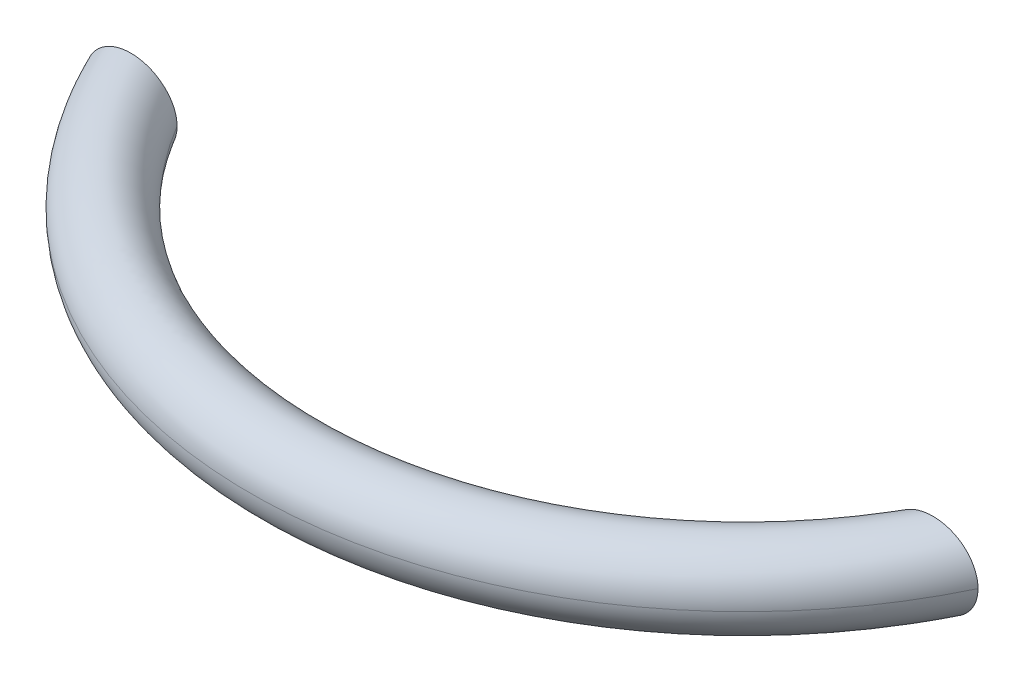
ISO-10303-21;
HEADER;
FILE_DESCRIPTION(('STEP AP214'),'2;1');
FILE_NAME('part.step','',(''),(''),'','','');
FILE_SCHEMA(('AUTOMOTIVE_DESIGN { 1 0 10303 214 1 1 1 1 }'));
ENDSEC;
DATA;
#1=APPLICATION_CONTEXT('core data for automotive mechanical design processes');
#2=APPLICATION_PROTOCOL_DEFINITION('international standard','automotive_design',2000,#1);
#3=PRODUCT_CONTEXT('',#1,'mechanical');
#4=PRODUCT('Part','Part','',(#3));
#5=PRODUCT_RELATED_PRODUCT_CATEGORY('part','',(#4));
#6=PRODUCT_DEFINITION_FORMATION('','',#4);
#7=PRODUCT_DEFINITION_CONTEXT('part definition',#1,'design');
#8=PRODUCT_DEFINITION('design','',#6,#7);
#9=PRODUCT_DEFINITION_SHAPE('','',#8);
#10=(LENGTH_UNIT() NAMED_UNIT(*) SI_UNIT(.MILLI.,.METRE.));
#11=(NAMED_UNIT(*) PLANE_ANGLE_UNIT() SI_UNIT($,.RADIAN.));
#12=(NAMED_UNIT(*) SI_UNIT($,.STERADIAN.) SOLID_ANGLE_UNIT());
#13=UNCERTAINTY_MEASURE_WITH_UNIT(LENGTH_MEASURE(1.E-05),#10,'distance_accuracy_value','');
#14=(GEOMETRIC_REPRESENTATION_CONTEXT(3) GLOBAL_UNCERTAINTY_ASSIGNED_CONTEXT((#13)) GLOBAL_UNIT_ASSIGNED_CONTEXT((#10,
#11,#12)) REPRESENTATION_CONTEXT('',''));
#15=CARTESIAN_POINT('',(0.,0.,0.));
#16=DIRECTION('',(0.,0.,1.));
#17=DIRECTION('',(1.,0.,0.));
#18=AXIS2_PLACEMENT_3D('',#15,#16,#17);
#19=CARTESIAN_POINT('',(48.,0.,5.));
#20=DIRECTION('',(0.,0.,1.));
#21=DIRECTION('',(1.,0.,0.));
#22=AXIS2_PLACEMENT_3D('',#19,#20,#21);
#23=PLANE('',#22);
#24=CARTESIAN_POINT('',(48.,0.,5.));
#25=DIRECTION('',(0.,0.,-1.));
#26=DIRECTION('',(0.,1.,0.));
#27=AXIS2_PLACEMENT_3D('',#24,#25,#26);
#28=CIRCLE('',#27,2.);
#29=CARTESIAN_POINT('',(48.,2.,5.));
#30=VERTEX_POINT('',#29);
#31=EDGE_CURVE('E18',#30,#30,#28,.F.);
#32=ORIENTED_EDGE('',*,*,#31,.F.);
#33=EDGE_LOOP('',(#32));
#34=FACE_BOUND('',#33,.T.);
#35=ADVANCED_FACE('F15',(#34),#23,.F.);
#36=CARTESIAN_POINT('',(-48.,0.,5.));
#37=DIRECTION('',(0.,0.,1.));
#38=DIRECTION('',(1.,0.,0.));
#39=AXIS2_PLACEMENT_3D('',#36,#37,#38);
#40=PLANE('',#39);
#41=CARTESIAN_POINT('',(-48.,0.,5.));
#42=DIRECTION('',(0.,0.,-1.));
#43=DIRECTION('',(0.,1.,0.));
#44=AXIS2_PLACEMENT_3D('',#41,#42,#43);
#45=CIRCLE('',#44,2.);
#46=CARTESIAN_POINT('',(-48.,2.,5.));
#47=VERTEX_POINT('',#46);
#48=EDGE_CURVE('E117',#47,#47,#45,.F.);
#49=ORIENTED_EDGE('',*,*,#48,.F.);
#50=EDGE_LOOP('',(#49));
#51=FACE_BOUND('',#50,.T.);
#52=ADVANCED_FACE('F106',(#51),#40,.F.);
#53=CARTESIAN_POINT('',(48.,0.,5.));
#54=DIRECTION('',(0.,0.,-1.));
#55=DIRECTION('',(0.,1.,0.));
#56=AXIS2_PLACEMENT_3D('',#53,#54,#55);
#57=CYLINDRICAL_SURFACE('',#56,2.);
#58=ORIENTED_EDGE('',*,*,#31,.T.);
#59=EDGE_LOOP('',(#58));
#60=FACE_BOUND('',#59,.T.);
#61=CARTESIAN_POINT('',(48.,0.,0.));
#62=DIRECTION('',(0.,0.,-1.));
#63=DIRECTION('',(0.,1.,0.));
#64=AXIS2_PLACEMENT_3D('',#61,#62,#63);
#65=CIRCLE('',#64,2.);
#66=CARTESIAN_POINT('',(48.,2.,0.));
#67=VERTEX_POINT('',#66);
#68=EDGE_CURVE('E118',#67,#67,#65,.F.);
#69=ORIENTED_EDGE('',*,*,#68,.F.);
#70=EDGE_LOOP('',(#69));
#71=FACE_BOUND('',#70,.T.);
#72=ADVANCED_FACE('F103',(#60,#71),#57,.F.);
#73=CARTESIAN_POINT('',(-48.,0.,5.));
#74=DIRECTION('',(0.,0.,-1.));
#75=DIRECTION('',(0.,1.,0.));
#76=AXIS2_PLACEMENT_3D('',#73,#74,#75);
#77=CYLINDRICAL_SURFACE('',#76,2.);
#78=ORIENTED_EDGE('',*,*,#48,.T.);
#79=EDGE_LOOP('',(#78));
#80=FACE_BOUND('',#79,.T.);
#81=CARTESIAN_POINT('',(-48.,0.,0.));
#82=DIRECTION('',(0.,0.,-1.));
#83=DIRECTION('',(0.,1.,0.));
#84=AXIS2_PLACEMENT_3D('',#81,#82,#83);
#85=CIRCLE('',#84,2.);
#86=CARTESIAN_POINT('',(-48.,2.,0.));
#87=VERTEX_POINT('',#86);
#88=EDGE_CURVE('E52',#87,#87,#85,.F.);
#89=ORIENTED_EDGE('',*,*,#88,.F.);
#90=EDGE_LOOP('',(#89));
#91=FACE_BOUND('',#90,.T.);
#92=ADVANCED_FACE('F98',(#80,#91),#77,.F.);
#93=CARTESIAN_POINT('',(-300.,-100.,0.));
#94=DIRECTION('',(0.,0.,1.));
#95=DIRECTION('',(1.,0.,0.));
#96=AXIS2_PLACEMENT_3D('',#93,#94,#95);
#97=PLANE('',#96);
#98=ORIENTED_EDGE('',*,*,#68,.T.);
#99=EDGE_LOOP('',(#98));
#100=FACE_BOUND('',#99,.T.);
#101=CARTESIAN_POINT('',(44.16082620787,0.,0.));
#102=CARTESIAN_POINT('',(44.1607976121978,-0.126758896457329,0.));
#103=CARTESIAN_POINT('',(44.1664467931148,-0.253507135557029,0.));
#104=CARTESIAN_POINT('',(44.1888878800013,-0.505966477043828,0.));
#105=CARTESIAN_POINT('',(44.2056755439542,-0.631677955828245,0.));
#106=CARTESIAN_POINT('',(44.2500779915023,-0.88056815615185,0.));
#107=CARTESIAN_POINT('',(44.2776422638022,-1.00375591221587,0.));
#108=CARTESIAN_POINT('',(44.3432128256796,-1.24731976918636,0.));
#109=CARTESIAN_POINT('',(44.3812196841951,-1.36769571651069,0.));
#110=CARTESIAN_POINT('',(44.4671304037343,-1.60467410485182,0.));
#111=CARTESIAN_POINT('',(44.515020558891,-1.72128151567552,0.));
#112=CARTESIAN_POINT('',(44.6201513745664,-1.95021941574082,0.));
#113=CARTESIAN_POINT('',(44.6773955790556,-2.06254826399504,0.));
#114=CARTESIAN_POINT('',(44.8622962912611,-2.39228101992836,0.));
#115=CARTESIAN_POINT('',(45.0031263752589,-2.60244600053541,0.));
#116=CARTESIAN_POINT('',(45.3233983352066,-3.01093822397029,0.));
#117=CARTESIAN_POINT('',(45.5046132868082,-3.20785989455715,0.));
#118=CARTESIAN_POINT('',(45.8939695752766,-3.57294610508179,0.));
#119=CARTESIAN_POINT('',(46.1021206484178,-3.74110019546751,0.));
#120=CARTESIAN_POINT('',(46.5693268064275,-4.0677162327602,0.));
#121=CARTESIAN_POINT('',(46.8314570148859,-4.22177090257292,0.));
#122=CARTESIAN_POINT('',(47.3758145396278,-4.48923793603577,0.));
#123=CARTESIAN_POINT('',(47.6580519661073,-4.60262967841921,0.));
#124=CARTESIAN_POINT('',(48.1087565258962,-4.74706979056194,0.));
#125=CARTESIAN_POINT('',(48.2727971004219,-4.79241667251744,0.));
#126=CARTESIAN_POINT('',(48.6039659467458,-4.86989103222702,0.));
#127=CARTESIAN_POINT('',(48.7710936073983,-4.90202109779854,0.));
#128=CARTESIAN_POINT('',(49.1073641094704,-4.95293796255453,0.));
#129=CARTESIAN_POINT('',(49.2765068769929,-4.97172524951722,0.));
#130=CARTESIAN_POINT('',(49.615899632548,-4.99587278804959,0.));
#131=CARTESIAN_POINT('',(49.7861506555518,-5.00121784697606,0.));
#132=CARTESIAN_POINT('',(50.3167513801996,-4.99670395586458,0.));
#133=CARTESIAN_POINT('',(50.6771910185005,-4.96321743424142,0.));
#134=CARTESIAN_POINT('',(51.3869167325174,-4.83456723029916,0.));
#135=CARTESIAN_POINT('',(51.736207335051,-4.73942892334753,0.));
#136=CARTESIAN_POINT('',(52.2384833402548,-4.55250119571357,0.));
#137=CARTESIAN_POINT('',(52.4003863665284,-4.48395235428304,0.));
#138=CARTESIAN_POINT('',(52.7172250557413,-4.33251226860007,0.));
#139=CARTESIAN_POINT('',(52.8721669256975,-4.24963413440816,0.));
#140=CARTESIAN_POINT('',(53.1736281886951,-4.06979284606716,0.));
#141=CARTESIAN_POINT('',(53.3201485090235,-3.97283124679449,0.));
#142=CARTESIAN_POINT('',(53.6032122460092,-3.76522947319249,0.));
#143=CARTESIAN_POINT('',(53.7397546839739,-3.65458795990985,0.));
#144=CARTESIAN_POINT('',(53.9889091157819,-3.43126761489818,0.));
#145=CARTESIAN_POINT('',(54.1025645300031,-3.31975192681105,0.));
#146=CARTESIAN_POINT('',(54.3190394126719,-3.08665899122357,0.));
#147=CARTESIAN_POINT('',(54.4218602394493,-2.96508300840017,0.));
#148=CARTESIAN_POINT('',(54.6154175331754,-2.71269875792599,0.));
#149=CARTESIAN_POINT('',(54.7061568936767,-2.58189271243093,0.));
#150=CARTESIAN_POINT('',(54.8743883049809,-2.31202604399339,0.));
#151=CARTESIAN_POINT('',(54.9518823104442,-2.17296664311337,0.));
#152=CARTESIAN_POINT('',(55.084693837362,-1.90369980004117,0.));
#153=CARTESIAN_POINT('',(55.1415207939843,-1.7742350104066,0.));
#154=CARTESIAN_POINT('',(55.2431975111577,-1.5106920169143,0.));
#155=CARTESIAN_POINT('',(55.2880489768931,-1.37661447293682,0.));
#156=CARTESIAN_POINT('',(55.3651488155189,-1.1051777473328,0.));
#157=CARTESIAN_POINT('',(55.3974223663554,-0.967825711768883,0.));
#158=CARTESIAN_POINT('',(55.4490669316481,-0.690781954694624,0.));
#159=CARTESIAN_POINT('',(55.4684462995686,-0.551091808183845,0.));
#160=CARTESIAN_POINT('',(55.4875076289764,-0.342504785007338,0.));
#161=CARTESIAN_POINT('',(55.4921943619742,-0.274032624666117,0.));
#162=CARTESIAN_POINT('',(55.498438453907,-0.137043581011102,0.));
#163=CARTESIAN_POINT('',(55.500000263258,-0.0685269005130842,0.));
#164=CARTESIAN_POINT('',(55.4999999993203,0.,0.));
#165=B_SPLINE_CURVE_WITH_KNOTS('',3,(#101,#102,#103,#104,#105,#106,#107,#108,#109,#110,#111,
#112,#113,#114,#115,#116,#117,#118,#119,#120,#121,#122,#123,#124,#125,#126,#127,#128,#129,#130,
#131,#132,#133,#134,#135,#136,#137,#138,#139,#140,#141,#142,#143,#144,#145,#146,#147,#148,#149,
#150,#151,#152,#153,#154,#155,#156,#157,#158,#159,#160,#161,#162,#163,#164),.UNSPECIFIED.,.F.,
.F.,(4,2,2,2,2,2,2,2,2,2,2,2,2,2,2,2,2,2,2,2,2,2,2,2,2,2,2,2,2,2,2,4),(0.,0.38013416915592,
0.760123649801504,1.13835302296334,1.51660300708787,1.8943319281141,2.27220429260185,
3.02790205403033,3.82767995687209,4.62774775749237,5.53632084965965,6.44535405430686,
6.95546660717311,7.46547923376564,7.97547321462785,8.48604334116439,9.56646357816603,
10.6464394052935,11.1732923039239,11.6996657041919,12.2259810346347,12.7523479202515,
13.2293746140697,13.7063414318252,14.1831938081122,14.6599757528552,15.0835787694388,
15.5071214371872,15.9298118658773,16.3522281882993,16.55806411932,16.7636066961601),.UNSPECIFIED.);
#166=CARTESIAN_POINT('',(44.16082620787,8.56729720200068E-11,0.));
#167=VERTEX_POINT('',#166);
#168=CARTESIAN_POINT('',(55.4999999993203,3.00001724467243E-10,0.));
#169=VERTEX_POINT('',#168);
#170=EDGE_CURVE('E43',#167,#169,#165,.T.);
#171=ORIENTED_EDGE('',*,*,#170,.F.);
#172=CARTESIAN_POINT('',(55.4999999993203,0.,0.));
#173=CARTESIAN_POINT('',(55.5000226893428,0.130519562455404,0.));
#174=CARTESIAN_POINT('',(55.4943375926483,0.261032362661259,0.));
#175=CARTESIAN_POINT('',(55.4717186280668,0.521049910770463,0.));
#176=CARTESIAN_POINT('',(55.4547873930845,0.650554887443749,0.));
#177=CARTESIAN_POINT('',(55.4099139265116,0.907217493159661,0.));
#178=CARTESIAN_POINT('',(55.382006709966,1.03438125367753,0.));
#179=CARTESIAN_POINT('',(55.3154918027981,1.28587837162248,0.));
#180=CARTESIAN_POINT('',(55.2768838603252,1.41021166235753,0.));
#181=CARTESIAN_POINT('',(55.1894036741985,1.65511662129208,0.));
#182=CARTESIAN_POINT('',(55.1405381770358,1.77569070238814,0.));
#183=CARTESIAN_POINT('',(55.0330044325842,2.01243377196767,0.));
#184=CARTESIAN_POINT('',(54.974332539828,2.12860110249083,0.));
#185=CARTESIAN_POINT('',(54.8477624148383,2.35579631678699,0.));
#186=CARTESIAN_POINT('',(54.7798638050831,2.46682399001571,0.));
#187=CARTESIAN_POINT('',(54.6354370678797,2.68316802762187,0.));
#188=CARTESIAN_POINT('',(54.5589056538459,2.78848219406565,0.));
#189=CARTESIAN_POINT('',(54.3949510194064,2.99655881952504,0.));
#190=CARTESIAN_POINT('',(54.3072328467341,3.09908906747247,0.));
#191=CARTESIAN_POINT('',(54.1239947181904,3.29694524501976,0.));
#192=CARTESIAN_POINT('',(54.0284719610492,3.39226856401869,0.));
#193=CARTESIAN_POINT('',(53.7313495568696,3.66677146196183,0.));
#194=CARTESIAN_POINT('',(53.519093464157,3.83461260686507,0.));
#195=CARTESIAN_POINT('',(53.0518300248272,4.15146540242182,0.));
#196=CARTESIAN_POINT('',(52.7946842875618,4.29729900698631,0.));
#197=CARTESIAN_POINT('',(52.261305276997,4.54839488048717,0.));
#198=CARTESIAN_POINT('',(51.9850648292411,4.65364180099749,0.));
#199=CARTESIAN_POINT('',(51.3909049627061,4.83177537724478,0.));
#200=CARTESIAN_POINT('',(51.0716367682829,4.90016503348468,0.));
#201=CARTESIAN_POINT('',(50.4263428372831,4.98688611627549,0.));
#202=CARTESIAN_POINT('',(50.1003140888399,5.00519472674161,0.));
#203=CARTESIAN_POINT('',(49.4223163346862,4.99174552735896,0.));
#204=CARTESIAN_POINT('',(49.0704296897963,4.95572615595388,0.));
#205=CARTESIAN_POINT('',(48.3769913906184,4.82644878340789,0.));
#206=CARTESIAN_POINT('',(48.0354433834846,4.7331708245265,0.));
#207=CARTESIAN_POINT('',(47.5351370433214,4.55006354265161,0.));
#208=CARTESIAN_POINT('',(47.3686032091545,4.48081617659275,0.));
#209=CARTESIAN_POINT('',(47.0423111513753,4.32791880380597,0.));
#210=CARTESIAN_POINT('',(46.882549891621,4.24427533779067,0.));
#211=CARTESIAN_POINT('',(46.5712109625042,4.06279318144531,0.));
#212=CARTESIAN_POINT('',(46.41963675473,3.96494855016139,0.));
#213=CARTESIAN_POINT('',(46.1264254070305,3.75548605170735,0.));
#214=CARTESIAN_POINT('',(45.9847823734137,3.64387646379353,0.));
#215=CARTESIAN_POINT('',(45.7225426821308,3.41556393932564,0.));
#216=CARTESIAN_POINT('',(45.6011673589879,3.29975583283478,0.));
#217=CARTESIAN_POINT('',(45.3699968548984,3.05720456687635,0.));
#218=CARTESIAN_POINT('',(45.2601948516754,2.93046793061828,0.));
#219=CARTESIAN_POINT('',(45.0536800701365,2.66677981475632,0.));
#220=CARTESIAN_POINT('',(44.9569635329763,2.52983128616112,0.));
#221=CARTESIAN_POINT('',(44.778178784938,2.24669135696689,0.));
#222=CARTESIAN_POINT('',(44.6961068894157,2.10050229389075,0.));
#223=CARTESIAN_POINT('',(44.5586244262845,1.82147653857728,0.));
#224=CARTESIAN_POINT('',(44.501083418492,1.68968679610439,0.));
#225=CARTESIAN_POINT('',(44.3987820483504,1.4212462082359,0.));
#226=CARTESIAN_POINT('',(44.3540189679259,1.28459640362088,0.));
#227=CARTESIAN_POINT('',(44.2781106807407,1.00795693146104,0.));
#228=CARTESIAN_POINT('',(44.2469296349847,0.867977094219688,0.));
#229=CARTESIAN_POINT('',(44.1985835907358,0.585692790362598,0.));
#230=CARTESIAN_POINT('',(44.1814072305328,0.443390303867156,1.23770393106307E-13));
#231=CARTESIAN_POINT('',(44.1678597990366,0.250588805341285,0.));
#232=CARTESIAN_POINT('',(44.1652212366122,0.200474728652236,0.));
#233=CARTESIAN_POINT('',(44.1617056981853,0.100242966690741,0.));
#234=CARTESIAN_POINT('',(44.1608266844643,0.0501253528895574,0.));
#235=CARTESIAN_POINT('',(44.16082620787,0.,0.));
#236=B_SPLINE_CURVE_WITH_KNOTS('',3,(#172,#173,#174,#175,#176,#177,#178,#179,#180,#181,#182,
#183,#184,#185,#186,#187,#188,#189,#190,#191,#192,#193,#194,#195,#196,#197,#198,#199,#200,#201,
#202,#203,#204,#205,#206,#207,#208,#209,#210,#211,#212,#213,#214,#215,#216,#217,#218,#219,#220,
#221,#222,#223,#224,#225,#226,#227,#228,#229,#230,#231,#232,#233,#234,#235),.UNSPECIFIED.,.F.,
.F.,(4,2,2,2,2,2,2,2,2,2,2,2,2,2,2,2,2,2,2,2,2,2,2,2,2,2,2,2,2,2,2,4),(0.,0.391424526781845,
0.782757446973487,1.17285195205057,1.56295563910936,1.95280355069989,2.34279670951008,
2.73280583014326,3.12296393507201,3.52731584629899,3.93181353301827,4.74032117920115,
5.62361946326044,6.50725145220503,7.48267007972721,8.45853301766729,9.51502355571004,
10.5718825475843,11.1123756966022,11.6526239235259,12.193098814294,12.7332501947913,
13.2358154632633,13.738082801342,14.2402055537153,14.7422017915177,15.1729996523089,
15.6037058069051,16.0332684663781,16.4624822828667,16.6130096162902,16.763362524194),.UNSPECIFIED.);
#237=EDGE_CURVE('E40',#169,#167,#236,.T.);
#238=ORIENTED_EDGE('',*,*,#237,.F.);
#239=EDGE_LOOP('',(#171,#238));
#240=FACE_BOUND('',#239,.T.);
#241=ADVANCED_FACE('F44',(#100,#240),#97,.F.);
#242=CARTESIAN_POINT('',(-300.,-100.,0.));
#243=DIRECTION('',(0.,0.,1.));
#244=DIRECTION('',(1.,0.,0.));
#245=AXIS2_PLACEMENT_3D('',#242,#243,#244);
#246=PLANE('',#245);
#247=ORIENTED_EDGE('',*,*,#88,.T.);
#248=EDGE_LOOP('',(#247));
#249=FACE_BOUND('',#248,.T.);
#250=CARTESIAN_POINT('',(-44.16082620787,0.,0.));
#251=CARTESIAN_POINT('',(-44.1607976121978,0.126758896457261,0.));
#252=CARTESIAN_POINT('',(-44.1664467931148,0.253507135556961,0.));
#253=CARTESIAN_POINT('',(-44.1888878800013,0.505966477043759,0.));
#254=CARTESIAN_POINT('',(-44.2056755439542,0.631677955828175,0.));
#255=CARTESIAN_POINT('',(-44.2500779915022,0.88056815615178,0.));
#256=CARTESIAN_POINT('',(-44.2776422638022,1.0037559122158,0.));
#257=CARTESIAN_POINT('',(-44.3432128256796,1.2473197691863,0.));
#258=CARTESIAN_POINT('',(-44.3812196841951,1.36769571651062,0.));
#259=CARTESIAN_POINT('',(-44.4671304037343,1.60467410485177,0.));
#260=CARTESIAN_POINT('',(-44.5150205588909,1.72128151567547,0.));
#261=CARTESIAN_POINT('',(-44.6201513745664,1.95021941574078,0.));
#262=CARTESIAN_POINT('',(-44.6773955790556,2.06254826399499,0.));
#263=CARTESIAN_POINT('',(-44.862296291261,2.3922810199283,0.));
#264=CARTESIAN_POINT('',(-45.0031263752588,2.60244600053536,0.));
#265=CARTESIAN_POINT('',(-45.3233983352065,3.01093822397024,0.));
#266=CARTESIAN_POINT('',(-45.5046132868082,3.20785989455708,0.));
#267=CARTESIAN_POINT('',(-45.8939695752765,3.57294610508172,0.));
#268=CARTESIAN_POINT('',(-46.1021206484177,3.74110019546746,0.));
#269=CARTESIAN_POINT('',(-46.5693268064274,4.06771623276016,0.));
#270=CARTESIAN_POINT('',(-46.8314570148858,4.22177090257289,0.));
#271=CARTESIAN_POINT('',(-47.3758145396277,4.48923793603574,0.));
#272=CARTESIAN_POINT('',(-47.6580519661072,4.6026296784192,0.));
#273=CARTESIAN_POINT('',(-48.108756525896,4.74706979056193,0.));
#274=CARTESIAN_POINT('',(-48.2727971004218,4.79241667251743,0.));
#275=CARTESIAN_POINT('',(-48.6039659467457,4.86989103222701,0.));
#276=CARTESIAN_POINT('',(-48.7710936073982,4.90202109779853,0.));
#277=CARTESIAN_POINT('',(-49.1073641094702,4.95293796255453,0.));
#278=CARTESIAN_POINT('',(-49.2765068769928,4.97172524951722,0.));
#279=CARTESIAN_POINT('',(-49.6158996325479,4.9958727880496,0.));
#280=CARTESIAN_POINT('',(-49.7861506555516,5.00121784697607,0.));
#281=CARTESIAN_POINT('',(-50.3167513801995,4.9967039558646,0.));
#282=CARTESIAN_POINT('',(-50.6771910185004,4.96321743424144,0.));
#283=CARTESIAN_POINT('',(-51.3869167325174,4.83456723029919,0.));
#284=CARTESIAN_POINT('',(-51.7362073350509,4.73942892334758,0.));
#285=CARTESIAN_POINT('',(-52.2384833402548,4.55250119571363,0.));
#286=CARTESIAN_POINT('',(-52.4003863665283,4.48395235428308,0.));
#287=CARTESIAN_POINT('',(-52.7172250557412,4.33251226860011,0.));
#288=CARTESIAN_POINT('',(-52.8721669256974,4.2496341344082,0.));
#289=CARTESIAN_POINT('',(-53.1736281886951,4.0697928460672,0.));
#290=CARTESIAN_POINT('',(-53.3201485090235,3.97283124679453,0.));
#291=CARTESIAN_POINT('',(-53.6032122460092,3.76522947319253,0.));
#292=CARTESIAN_POINT('',(-53.7397546839739,3.65458795990988,0.));
#293=CARTESIAN_POINT('',(-53.9889091157818,3.43126761489821,0.));
#294=CARTESIAN_POINT('',(-54.1025645300031,3.31975192681109,0.));
#295=CARTESIAN_POINT('',(-54.3190394126719,3.08665899122361,0.));
#296=CARTESIAN_POINT('',(-54.4218602394493,2.96508300840022,0.));
#297=CARTESIAN_POINT('',(-54.6154175331754,2.71269875792605,0.));
#298=CARTESIAN_POINT('',(-54.7061568936767,2.58189271243099,0.));
#299=CARTESIAN_POINT('',(-54.8743883049809,2.31202604399347,0.));
#300=CARTESIAN_POINT('',(-54.9518823104442,2.17296664311345,0.));
#301=CARTESIAN_POINT('',(-55.084693837362,1.90369980004125,0.));
#302=CARTESIAN_POINT('',(-55.1415207939843,1.77423501040668,0.));
#303=CARTESIAN_POINT('',(-55.2431975111576,1.51069201691438,0.));
#304=CARTESIAN_POINT('',(-55.2880489768931,1.3766144729369,0.));
#305=CARTESIAN_POINT('',(-55.3651488155188,1.1051777473329,0.));
#306=CARTESIAN_POINT('',(-55.3974223663554,0.967825711768986,0.));
#307=CARTESIAN_POINT('',(-55.4490669316481,0.690781954694731,0.));
#308=CARTESIAN_POINT('',(-55.4684462995686,0.55109180818395,0.));
#309=CARTESIAN_POINT('',(-55.4875076289764,0.342504785007437,0.));
#310=CARTESIAN_POINT('',(-55.4921943619742,0.274032624666211,0.));
#311=CARTESIAN_POINT('',(-55.498438453907,0.137043581011184,0.));
#312=CARTESIAN_POINT('',(-55.500000263258,0.0685269005131608,0.));
#313=CARTESIAN_POINT('',(-55.4999999993203,0.,0.));
#314=B_SPLINE_CURVE_WITH_KNOTS('',3,(#250,#251,#252,#253,#254,#255,#256,#257,#258,#259,#260,
#261,#262,#263,#264,#265,#266,#267,#268,#269,#270,#271,#272,#273,#274,#275,#276,#277,#278,#279,
#280,#281,#282,#283,#284,#285,#286,#287,#288,#289,#290,#291,#292,#293,#294,#295,#296,#297,#298,
#299,#300,#301,#302,#303,#304,#305,#306,#307,#308,#309,#310,#311,#312,#313),.UNSPECIFIED.,.F.,
.F.,(4,2,2,2,2,2,2,2,2,2,2,2,2,2,2,2,2,2,2,2,2,2,2,2,2,2,2,2,2,2,2,4),(0.,0.380134169155918,
0.7601236498015,1.13835302296334,1.51660300708788,1.8943319281141,2.27220429260185,
3.02790205403031,3.82767995687206,4.62774775749235,5.53632084965963,6.44535405430684,
6.95546660717308,7.46547923376561,7.97547321462782,8.48604334116437,9.56646357816603,
10.6464394052935,11.1732923039239,11.6996657041919,12.2259810346347,12.7523479202515,
13.2293746140697,13.7063414318252,14.1831938081123,14.6599757528552,15.0835787694388,
15.5071214371872,15.9298118658773,16.3522281882993,16.5580641193201,16.7636066961601),.UNSPECIFIED.);
#315=CARTESIAN_POINT('',(-44.16082620787,2.14268166148894E-10,0.));
#316=VERTEX_POINT('',#315);
#317=CARTESIAN_POINT('',(-55.4999999993203,1.7142474908356E-10,0.));
#318=VERTEX_POINT('',#317);
#319=EDGE_CURVE('E32',#316,#318,#314,.T.);
#320=ORIENTED_EDGE('',*,*,#319,.F.);
#321=CARTESIAN_POINT('',(-55.4999999993203,0.,0.));
#322=CARTESIAN_POINT('',(-55.5000226893428,-0.130519562455336,0.));
#323=CARTESIAN_POINT('',(-55.4943375926483,-0.261032362661187,0.));
#324=CARTESIAN_POINT('',(-55.4717186280667,-0.521049910770386,0.));
#325=CARTESIAN_POINT('',(-55.4547873930844,-0.650554887443671,0.));
#326=CARTESIAN_POINT('',(-55.4099139265116,-0.907217493159587,0.));
#327=CARTESIAN_POINT('',(-55.382006709966,-1.03438125367746,0.));
#328=CARTESIAN_POINT('',(-55.3154918027981,-1.28587837162241,0.));
#329=CARTESIAN_POINT('',(-55.2768838603251,-1.41021166235746,0.));
#330=CARTESIAN_POINT('',(-55.1894036741984,-1.65511662129201,0.));
#331=CARTESIAN_POINT('',(-55.1405381770358,-1.77569070238808,0.));
#332=CARTESIAN_POINT('',(-55.0330044325842,-2.01243377196761,0.));
#333=CARTESIAN_POINT('',(-54.974332539828,-2.12860110249075,0.));
#334=CARTESIAN_POINT('',(-54.8477624148383,-2.35579631678691,0.));
#335=CARTESIAN_POINT('',(-54.7798638050832,-2.46682399001565,0.));
#336=CARTESIAN_POINT('',(-54.6354370678798,-2.68316802762181,0.));
#337=CARTESIAN_POINT('',(-54.5589056538459,-2.7884821940656,0.));
#338=CARTESIAN_POINT('',(-54.3949510194064,-2.99655881952499,0.));
#339=CARTESIAN_POINT('',(-54.3072328467341,-3.09908906747242,0.));
#340=CARTESIAN_POINT('',(-54.1239947181905,-3.2969452450197,0.));
#341=CARTESIAN_POINT('',(-54.0284719610492,-3.39226856401861,0.));
#342=CARTESIAN_POINT('',(-53.7313495568696,-3.66677146196173,0.));
#343=CARTESIAN_POINT('',(-53.5190934641571,-3.83461260686499,0.));
#344=CARTESIAN_POINT('',(-53.0518300248273,-4.15146540242178,0.));
#345=CARTESIAN_POINT('',(-52.7946842875619,-4.29729900698626,0.));
#346=CARTESIAN_POINT('',(-52.2613052769971,-4.54839488048712,0.));
#347=CARTESIAN_POINT('',(-51.9850648292412,-4.65364180099744,0.));
#348=CARTESIAN_POINT('',(-51.3909049627062,-4.83177537724473,0.));
#349=CARTESIAN_POINT('',(-51.0716367682831,-4.90016503348464,0.));
#350=CARTESIAN_POINT('',(-50.4263428372832,-4.98688611627547,0.));
#351=CARTESIAN_POINT('',(-50.10031408884,-5.0051947267416,0.));
#352=CARTESIAN_POINT('',(-49.4223163346863,-4.99174552735895,0.));
#353=CARTESIAN_POINT('',(-49.0704296897964,-4.95572615595388,0.));
#354=CARTESIAN_POINT('',(-48.3769913906185,-4.82644878340789,0.));
#355=CARTESIAN_POINT('',(-48.0354433834848,-4.7331708245265,0.));
#356=CARTESIAN_POINT('',(-47.5351370433216,-4.55006354265163,0.));
#357=CARTESIAN_POINT('',(-47.3686032091546,-4.48081617659279,0.));
#358=CARTESIAN_POINT('',(-47.0423111513754,-4.32791880380602,0.));
#359=CARTESIAN_POINT('',(-46.8825498916212,-4.24427533779072,0.));
#360=CARTESIAN_POINT('',(-46.5712109625043,-4.06279318144536,0.));
#361=CARTESIAN_POINT('',(-46.4196367547301,-3.96494855016145,0.));
#362=CARTESIAN_POINT('',(-46.1264254070307,-3.75548605170743,0.));
#363=CARTESIAN_POINT('',(-45.9847823734138,-3.64387646379363,1.20805371541974E-13));
#364=CARTESIAN_POINT('',(-45.722542682131,-3.41556393932575,1.13185549418528E-13));
#365=CARTESIAN_POINT('',(-45.6011673589881,-3.29975583283489,0.));
#366=CARTESIAN_POINT('',(-45.3699968548985,-3.05720456687644,0.));
#367=CARTESIAN_POINT('',(-45.2601948516755,-2.93046793061836,0.));
#368=CARTESIAN_POINT('',(-45.0536800701366,-2.6667798147564,0.));
#369=CARTESIAN_POINT('',(-44.9569635329763,-2.52983128616121,0.));
#370=CARTESIAN_POINT('',(-44.778178784938,-2.24669135696696,0.));
#371=CARTESIAN_POINT('',(-44.6961068894157,-2.1005022938908,0.));
#372=CARTESIAN_POINT('',(-44.5586244262845,-1.82147653857732,0.));
#373=CARTESIAN_POINT('',(-44.5010834184921,-1.68968679610445,0.));
#374=CARTESIAN_POINT('',(-44.3987820483504,-1.42124620823597,0.));
#375=CARTESIAN_POINT('',(-44.3540189679259,-1.28459640362094,0.));
#376=CARTESIAN_POINT('',(-44.2781106807407,-1.0079569314611,0.));
#377=CARTESIAN_POINT('',(-44.2469296349847,-0.867977094219753,0.));
#378=CARTESIAN_POINT('',(-44.1985835907358,-0.585692790362664,0.));
#379=CARTESIAN_POINT('',(-44.1814072305328,-0.443390303867219,0.));
#380=CARTESIAN_POINT('',(-44.1678597990367,-0.250588805341348,0.));
#381=CARTESIAN_POINT('',(-44.1652212366123,-0.200474728652301,0.));
#382=CARTESIAN_POINT('',(-44.1617056981853,-0.100242966690808,0.));
#383=CARTESIAN_POINT('',(-44.1608266844643,-0.0501253528896253,0.));
#384=CARTESIAN_POINT('',(-44.16082620787,0.,0.));
#385=B_SPLINE_CURVE_WITH_KNOTS('',3,(#321,#322,#323,#324,#325,#326,#327,#328,#329,#330,#331,
#332,#333,#334,#335,#336,#337,#338,#339,#340,#341,#342,#343,#344,#345,#346,#347,#348,#349,#350,
#351,#352,#353,#354,#355,#356,#357,#358,#359,#360,#361,#362,#363,#364,#365,#366,#367,#368,#369,
#370,#371,#372,#373,#374,#375,#376,#377,#378,#379,#380,#381,#382,#383,#384),.UNSPECIFIED.,.F.,
.F.,(4,2,2,2,2,2,2,2,2,2,2,2,2,2,2,2,2,2,2,2,2,2,2,2,2,2,2,2,2,2,2,4),(0.,0.39142452678184,
0.782757446973483,1.17285195205057,1.56295563910935,1.95280355069988,2.34279670951008,
2.73280583014325,3.12296393507199,3.52731584629896,3.93181353301823,4.74032117920108,
5.62361946326036,6.50725145220495,7.48267007972715,8.45853301766724,9.51502355570998,
10.5718825475842,11.1123756966021,11.6526239235258,12.1930988142938,12.7332501947912,
13.2358154632631,13.7380828013419,14.2402055537152,14.7422017915176,15.1729996523089,
15.603705806905,16.0332684663781,16.4624822828667,16.6130096162901,16.763362524194),.UNSPECIFIED.);
#386=EDGE_CURVE('E24',#318,#316,#385,.T.);
#387=ORIENTED_EDGE('',*,*,#386,.F.);
#388=EDGE_LOOP('',(#320,#387));
#389=FACE_BOUND('',#388,.T.);
#390=ADVANCED_FACE('F71',(#249,#389),#246,.F.);
#391=CARTESIAN_POINT('',(1.42805185184653E-10,0.,-88.0071428571428));
#392=CARTESIAN_POINT('',(1.42805185184653E-10,10.0000000000001,-88.0071428571427));
#393=CARTESIAN_POINT('',(1.42804572881476E-10,9.99999999999994,-78.0071428571426));
#394=CARTESIAN_POINT('',(1.42804572881476E-10,0.,-78.0071428571428));
#395=(BOUNDED_CURVE() B_SPLINE_CURVE(3,(#391,#392,#393,#394),.UNSPECIFIED.,.F.,
.F.) B_SPLINE_CURVE_WITH_KNOTS((4,4),(0.,1.),
.UNSPECIFIED.) CURVE() GEOMETRIC_REPRESENTATION_ITEM() RATIONAL_B_SPLINE_CURVE((1.,
0.333333333333333,0.333333333333333,1.)) REPRESENTATION_ITEM(''));
#396=CARTESIAN_POINT('',(0.,0.,-26.503571429));
#397=DIRECTION('',(0.,-1.,0.));
#398=AXIS1_PLACEMENT('',#396,#397);
#399=SURFACE_OF_REVOLUTION('',#395,#398);
#400=CARTESIAN_POINT('',(0.,4.28604553801915E-10,-26.503571429));
#401=DIRECTION('',(0.,-1.,0.));
#402=DIRECTION('',(2.77271204543001E-12,0.,-1.));
#403=AXIS2_PLACEMENT_3D('',#400,#401,#402);
#404=CIRCLE('',#403,51.5035714281428);
#405=EDGE_CURVE('E10',#316,#167,#404,.F.);
#406=ORIENTED_EDGE('',*,*,#405,.F.);
#407=ORIENTED_EDGE('',*,*,#319,.T.);
#408=CARTESIAN_POINT('',(0.,4.2860381910259E-10,-26.503571429));
#409=DIRECTION('',(0.,-1.,0.));
#410=DIRECTION('',(2.32190069403528E-12,0.,-1.));
#411=AXIS2_PLACEMENT_3D('',#408,#409,#410);
#412=CIRCLE('',#411,61.5035714281428);
#413=EDGE_CURVE('E47',#169,#318,#412,.T.);
#414=ORIENTED_EDGE('',*,*,#413,.F.);
#415=ORIENTED_EDGE('',*,*,#237,.T.);
#416=EDGE_LOOP('',(#406,#407,#414,#415));
#417=FACE_BOUND('',#416,.T.);
#418=ADVANCED_FACE('F50',(#417),#399,.F.);
#419=CARTESIAN_POINT('',(1.42804572881476E-10,0.,-78.0071428571428));
#420=CARTESIAN_POINT('',(1.42804572881476E-10,-9.99999999999998,-78.0071428571428));
#421=CARTESIAN_POINT('',(1.42805185184653E-10,-9.99999999999998,-88.0071428571428));
#422=CARTESIAN_POINT('',(1.42805185184653E-10,0.,-88.0071428571428));
#423=(BOUNDED_CURVE() B_SPLINE_CURVE(3,(#419,#420,#421,#422),.UNSPECIFIED.,.F.,
.F.) B_SPLINE_CURVE_WITH_KNOTS((4,4),(0.,1.),
.UNSPECIFIED.) CURVE() GEOMETRIC_REPRESENTATION_ITEM() RATIONAL_B_SPLINE_CURVE((1.,
0.333333333333333,0.333333333333333,1.)) REPRESENTATION_ITEM(''));
#424=CARTESIAN_POINT('',(0.,0.,-26.503571429));
#425=DIRECTION('',(0.,-1.,0.));
#426=AXIS1_PLACEMENT('',#424,#425);
#427=SURFACE_OF_REVOLUTION('',#423,#426);
#428=ORIENTED_EDGE('',*,*,#386,.T.);
#429=ORIENTED_EDGE('',*,*,#405,.T.);
#430=ORIENTED_EDGE('',*,*,#170,.T.);
#431=ORIENTED_EDGE('',*,*,#413,.T.);
#432=EDGE_LOOP('',(#428,#429,#430,#431));
#433=FACE_BOUND('',#432,.T.);
#434=ADVANCED_FACE('F54',(#433),#427,.F.);
#435=CLOSED_SHELL('',(#35,#52,#72,#92,#241,#390,#418,#434));
#436=MANIFOLD_SOLID_BREP('B1',#435);
#437=ADVANCED_BREP_SHAPE_REPRESENTATION('',(#18,#436),#14);
#438=SHAPE_DEFINITION_REPRESENTATION(#9,#437);
ENDSEC;
END-ISO-10303-21;
